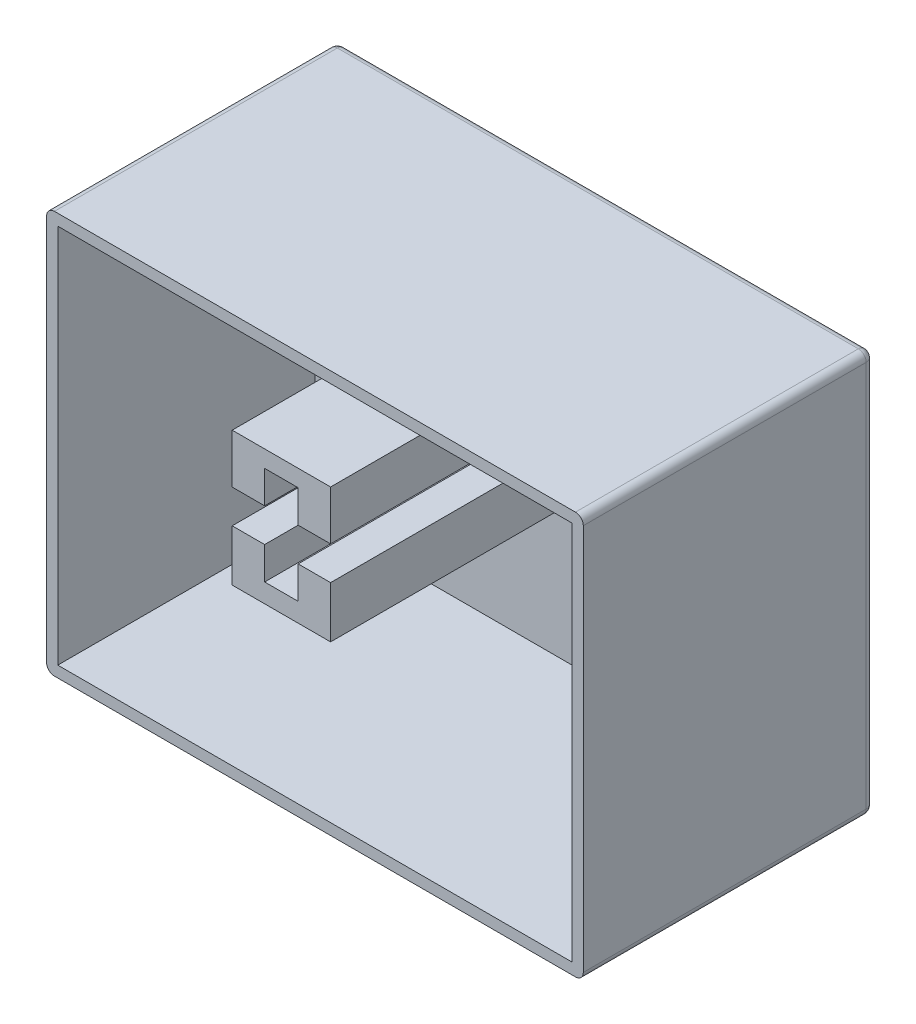
ISO-10303-21;
HEADER;
FILE_DESCRIPTION(('STEP AP214'),'2;1');
FILE_NAME('part.step','',(''),(''),'','','');
FILE_SCHEMA(('AUTOMOTIVE_DESIGN { 1 0 10303 214 1 1 1 1 }'));
ENDSEC;
DATA;
#1=APPLICATION_CONTEXT('core data for automotive mechanical design processes');
#2=APPLICATION_PROTOCOL_DEFINITION('international standard','automotive_design',2000,#1);
#3=PRODUCT_CONTEXT('',#1,'mechanical');
#4=PRODUCT('Part','Part','',(#3));
#5=PRODUCT_RELATED_PRODUCT_CATEGORY('part','',(#4));
#6=PRODUCT_DEFINITION_FORMATION('','',#4);
#7=PRODUCT_DEFINITION_CONTEXT('part definition',#1,'design');
#8=PRODUCT_DEFINITION('design','',#6,#7);
#9=PRODUCT_DEFINITION_SHAPE('','',#8);
#10=(LENGTH_UNIT() NAMED_UNIT(*) SI_UNIT(.MILLI.,.METRE.));
#11=(NAMED_UNIT(*) PLANE_ANGLE_UNIT() SI_UNIT($,.RADIAN.));
#12=(NAMED_UNIT(*) SI_UNIT($,.STERADIAN.) SOLID_ANGLE_UNIT());
#13=UNCERTAINTY_MEASURE_WITH_UNIT(LENGTH_MEASURE(1.E-05),#10,'distance_accuracy_value','');
#14=(GEOMETRIC_REPRESENTATION_CONTEXT(3) GLOBAL_UNCERTAINTY_ASSIGNED_CONTEXT((#13)) GLOBAL_UNIT_ASSIGNED_CONTEXT((#10,
#11,#12)) REPRESENTATION_CONTEXT('',''));
#15=CARTESIAN_POINT('',(0.,0.,0.));
#16=DIRECTION('',(0.,0.,1.));
#17=DIRECTION('',(1.,0.,0.));
#18=AXIS2_PLACEMENT_3D('',#15,#16,#17);
#19=CARTESIAN_POINT('',(-0.8,0.795549291488783,1.5));
#20=DIRECTION('',(0.,1.,0.));
#21=DIRECTION('',(-1.,0.,0.));
#22=AXIS2_PLACEMENT_3D('',#19,#20,#21);
#23=PLANE('',#22);
#24=DIRECTION('',(-1.,0.,0.));
#25=VECTOR('',#24,1.);
#26=CARTESIAN_POINT('',(-0.8,0.795549291488783,11.5));
#27=LINE('',#26,#25);
#28=CARTESIAN_POINT('',(-0.8,0.795549291488783,11.5));
#29=VERTEX_POINT('',#28);
#30=CARTESIAN_POINT('',(-2.25,0.795549291488783,11.5));
#31=VERTEX_POINT('',#30);
#32=EDGE_CURVE('E318',#29,#31,#27,.T.);
#33=ORIENTED_EDGE('',*,*,#32,.T.);
#34=DIRECTION('',(0.,0.,-1.));
#35=VECTOR('',#34,1.);
#36=CARTESIAN_POINT('',(-2.25,0.795549291488783,1.5));
#37=LINE('',#36,#35);
#38=CARTESIAN_POINT('',(-2.25,0.795549291488783,1.5));
#39=VERTEX_POINT('',#38);
#40=EDGE_CURVE('E300',#31,#39,#37,.T.);
#41=ORIENTED_EDGE('',*,*,#40,.T.);
#42=DIRECTION('',(-1.,0.,0.));
#43=VECTOR('',#42,1.);
#44=CARTESIAN_POINT('',(-0.8,0.795549291488783,1.5));
#45=LINE('',#44,#43);
#46=CARTESIAN_POINT('',(-0.8,0.795549291488783,1.5));
#47=VERTEX_POINT('',#46);
#48=EDGE_CURVE('E245',#47,#39,#45,.T.);
#49=ORIENTED_EDGE('',*,*,#48,.F.);
#50=DIRECTION('',(0.,0.,1.));
#51=VECTOR('',#50,1.);
#52=CARTESIAN_POINT('',(-0.8,0.795549291488783,1.5));
#53=LINE('',#52,#51);
#54=EDGE_CURVE('E327',#47,#29,#53,.T.);
#55=ORIENTED_EDGE('',*,*,#54,.T.);
#56=EDGE_LOOP('',(#33,#41,#49,#55));
#57=FACE_BOUND('',#56,.T.);
#58=ADVANCED_FACE('F41',(#57),#23,.F.);
#59=CARTESIAN_POINT('',(-0.799999999999999,-0.704450708511217,1.5));
#60=DIRECTION('',(0.,-1.,0.));
#61=DIRECTION('',(0.,0.,-1.));
#62=AXIS2_PLACEMENT_3D('',#59,#60,#61);
#63=PLANE('',#62);
#64=DIRECTION('',(1.,0.,0.));
#65=VECTOR('',#64,1.);
#66=CARTESIAN_POINT('',(-0.799999999999999,-0.704450708511217,1.5));
#67=LINE('',#66,#65);
#68=CARTESIAN_POINT('',(-2.25,-0.704450708511217,1.5));
#69=VERTEX_POINT('',#68);
#70=CARTESIAN_POINT('',(-0.799999999999999,-0.704450708511217,1.5));
#71=VERTEX_POINT('',#70);
#72=EDGE_CURVE('E309',#69,#71,#67,.T.);
#73=ORIENTED_EDGE('',*,*,#72,.F.);
#74=DIRECTION('',(0.,0.,1.));
#75=VECTOR('',#74,1.);
#76=CARTESIAN_POINT('',(-2.25,-0.704450708511217,1.5));
#77=LINE('',#76,#75);
#78=CARTESIAN_POINT('',(-2.25,-0.704450708511217,11.5));
#79=VERTEX_POINT('',#78);
#80=EDGE_CURVE('E11',#69,#79,#77,.T.);
#81=ORIENTED_EDGE('',*,*,#80,.T.);
#82=DIRECTION('',(1.,0.,0.));
#83=VECTOR('',#82,1.);
#84=CARTESIAN_POINT('',(-0.799999999999999,-0.704450708511217,11.5));
#85=LINE('',#84,#83);
#86=CARTESIAN_POINT('',(-0.799999999999999,-0.704450708511217,11.5));
#87=VERTEX_POINT('',#86);
#88=EDGE_CURVE('E303',#79,#87,#85,.T.);
#89=ORIENTED_EDGE('',*,*,#88,.T.);
#90=DIRECTION('',(0.,0.,1.));
#91=VECTOR('',#90,1.);
#92=CARTESIAN_POINT('',(-0.799999999999999,-0.704450708511217,1.5));
#93=LINE('',#92,#91);
#94=EDGE_CURVE('E330',#71,#87,#93,.T.);
#95=ORIENTED_EDGE('',*,*,#94,.F.);
#96=EDGE_LOOP('',(#73,#81,#89,#95));
#97=FACE_BOUND('',#96,.T.);
#98=ADVANCED_FACE('F578',(#97),#63,.F.);
#99=CARTESIAN_POINT('',(-0.799999999999999,-3.,11.5));
#100=DIRECTION('',(-1.,0.,0.));
#101=DIRECTION('',(0.,0.,1.));
#102=AXIS2_PLACEMENT_3D('',#99,#100,#101);
#103=PLANE('',#102);
#104=DIRECTION('',(0.,1.,0.));
#105=VECTOR('',#104,1.);
#106=CARTESIAN_POINT('',(-0.799999999999999,-3.,11.5));
#107=LINE('',#106,#105);
#108=CARTESIAN_POINT('',(-0.799999999999999,3.,11.5));
#109=VERTEX_POINT('',#108);
#110=EDGE_CURVE('E341',#29,#109,#107,.T.);
#111=ORIENTED_EDGE('',*,*,#110,.F.);
#112=ORIENTED_EDGE('',*,*,#54,.F.);
#113=DIRECTION('',(0.,1.,0.));
#114=VECTOR('',#113,1.);
#115=CARTESIAN_POINT('',(-0.799999999999999,-3.,1.5));
#116=LINE('',#115,#114);
#117=CARTESIAN_POINT('',(-0.799999999999999,3.,1.5));
#118=VERTEX_POINT('',#117);
#119=EDGE_CURVE('E326',#47,#118,#116,.T.);
#120=ORIENTED_EDGE('',*,*,#119,.T.);
#121=DIRECTION('',(0.,0.,-1.));
#122=VECTOR('',#121,1.);
#123=CARTESIAN_POINT('',(-0.799999999999999,3.,11.5));
#124=LINE('',#123,#122);
#125=EDGE_CURVE('E381',#109,#118,#124,.T.);
#126=ORIENTED_EDGE('',*,*,#125,.F.);
#127=EDGE_LOOP('',(#111,#112,#120,#126));
#128=FACE_BOUND('',#127,.T.);
#129=ADVANCED_FACE('F605',(#128),#103,.F.);
#130=CARTESIAN_POINT('',(-5.2,-3.,11.5));
#131=DIRECTION('',(1.,0.,0.));
#132=DIRECTION('',(0.,0.,-1.));
#133=AXIS2_PLACEMENT_3D('',#130,#131,#132);
#134=PLANE('',#133);
#135=DIRECTION('',(0.,-1.,0.));
#136=VECTOR('',#135,1.);
#137=CARTESIAN_POINT('',(-5.2,-3.,1.5));
#138=LINE('',#137,#136);
#139=CARTESIAN_POINT('',(-5.2,3.,1.5));
#140=VERTEX_POINT('',#139);
#141=CARTESIAN_POINT('',(-5.2,0.795549291488783,1.5));
#142=VERTEX_POINT('',#141);
#143=EDGE_CURVE('E362',#140,#142,#138,.T.);
#144=ORIENTED_EDGE('',*,*,#143,.T.);
#145=DIRECTION('',(0.,0.,1.));
#146=VECTOR('',#145,1.);
#147=CARTESIAN_POINT('',(-5.2,0.795549291488783,1.5));
#148=LINE('',#147,#146);
#149=CARTESIAN_POINT('',(-5.2,0.795549291488783,11.5));
#150=VERTEX_POINT('',#149);
#151=EDGE_CURVE('E322',#142,#150,#148,.T.);
#152=ORIENTED_EDGE('',*,*,#151,.T.);
#153=DIRECTION('',(0.,-1.,0.));
#154=VECTOR('',#153,1.);
#155=CARTESIAN_POINT('',(-5.2,-3.,11.5));
#156=LINE('',#155,#154);
#157=CARTESIAN_POINT('',(-5.2,3.,11.5));
#158=VERTEX_POINT('',#157);
#159=EDGE_CURVE('E345',#158,#150,#156,.T.);
#160=ORIENTED_EDGE('',*,*,#159,.F.);
#161=DIRECTION('',(0.,0.,-1.));
#162=VECTOR('',#161,1.);
#163=CARTESIAN_POINT('',(-5.2,3.,11.5));
#164=LINE('',#163,#162);
#165=EDGE_CURVE('E377',#158,#140,#164,.T.);
#166=ORIENTED_EDGE('',*,*,#165,.T.);
#167=EDGE_LOOP('',(#144,#152,#160,#166));
#168=FACE_BOUND('',#167,.T.);
#169=ADVANCED_FACE('F608',(#168),#134,.F.);
#170=CARTESIAN_POINT('',(0.,0.,11.5));
#171=DIRECTION('',(0.,0.,-1.));
#172=DIRECTION('',(-1.,0.,0.));
#173=AXIS2_PLACEMENT_3D('',#170,#171,#172);
#174=PLANE('',#173);
#175=DIRECTION('',(-1.,0.,0.));
#176=VECTOR('',#175,1.);
#177=CARTESIAN_POINT('',(-3.75,2.24554929148878,11.5));
#178=LINE('',#177,#176);
#179=CARTESIAN_POINT('',(-2.25,2.24554929148878,11.5));
#180=VERTEX_POINT('',#179);
#181=CARTESIAN_POINT('',(-3.75,2.24554929148878,11.5));
#182=VERTEX_POINT('',#181);
#183=EDGE_CURVE('E277',#180,#182,#178,.T.);
#184=ORIENTED_EDGE('',*,*,#183,.F.);
#185=DIRECTION('',(0.,1.,0.));
#186=VECTOR('',#185,1.);
#187=CARTESIAN_POINT('',(-2.25,-2.15445070851122,11.5));
#188=LINE('',#187,#186);
#189=EDGE_CURVE('E255',#31,#180,#188,.T.);
#190=ORIENTED_EDGE('',*,*,#189,.F.);
#191=ORIENTED_EDGE('',*,*,#32,.F.);
#192=ORIENTED_EDGE('',*,*,#110,.T.);
#193=DIRECTION('',(-1.,0.,0.));
#194=VECTOR('',#193,1.);
#195=CARTESIAN_POINT('',(-5.2,3.,11.5));
#196=LINE('',#195,#194);
#197=EDGE_CURVE('E340',#109,#158,#196,.T.);
#198=ORIENTED_EDGE('',*,*,#197,.T.);
#199=ORIENTED_EDGE('',*,*,#159,.T.);
#200=CARTESIAN_POINT('',(-3.75,0.795549291488783,11.5));
#201=VERTEX_POINT('',#200);
#202=EDGE_CURVE('E317',#201,#150,#27,.T.);
#203=ORIENTED_EDGE('',*,*,#202,.F.);
#204=DIRECTION('',(0.,-1.,0.));
#205=VECTOR('',#204,1.);
#206=CARTESIAN_POINT('',(-3.75,-2.15445070851122,11.5));
#207=LINE('',#206,#205);
#208=EDGE_CURVE('E281',#182,#201,#207,.T.);
#209=ORIENTED_EDGE('',*,*,#208,.F.);
#210=EDGE_LOOP('',(#184,#190,#191,#192,#198,#199,#203,#209));
#211=FACE_BOUND('',#210,.T.);
#212=ADVANCED_FACE('F597',(#211),#174,.F.);
#213=CARTESIAN_POINT('',(0.,0.,1.5));
#214=DIRECTION('',(0.,0.,-1.));
#215=DIRECTION('',(-1.,0.,0.));
#216=AXIS2_PLACEMENT_3D('',#213,#214,#215);
#217=PLANE('',#216);
#218=DIRECTION('',(0.,1.,0.));
#219=VECTOR('',#218,1.);
#220=CARTESIAN_POINT('',(-2.25,-2.15445070851122,1.5));
#221=LINE('',#220,#219);
#222=CARTESIAN_POINT('',(-2.25,-2.15445070851122,1.5));
#223=VERTEX_POINT('',#222);
#224=EDGE_CURVE('E65',#223,#69,#221,.T.);
#225=ORIENTED_EDGE('',*,*,#224,.T.);
#226=ORIENTED_EDGE('',*,*,#72,.T.);
#227=CARTESIAN_POINT('',(-0.799999999999999,-3.,1.5));
#228=VERTEX_POINT('',#227);
#229=EDGE_CURVE('E353',#228,#71,#116,.T.);
#230=ORIENTED_EDGE('',*,*,#229,.F.);
#231=DIRECTION('',(1.,0.,0.));
#232=VECTOR('',#231,1.);
#233=CARTESIAN_POINT('',(-5.2,-3.,1.5));
#234=LINE('',#233,#232);
#235=CARTESIAN_POINT('',(-5.2,-3.,1.5));
#236=VERTEX_POINT('',#235);
#237=EDGE_CURVE('E366',#236,#228,#234,.T.);
#238=ORIENTED_EDGE('',*,*,#237,.F.);
#239=CARTESIAN_POINT('',(-5.2,-0.704450708511217,1.5));
#240=VERTEX_POINT('',#239);
#241=EDGE_CURVE('E361',#240,#236,#138,.T.);
#242=ORIENTED_EDGE('',*,*,#241,.F.);
#243=CARTESIAN_POINT('',(-3.75,-0.704450708511217,1.5));
#244=VERTEX_POINT('',#243);
#245=EDGE_CURVE('E304',#240,#244,#67,.T.);
#246=ORIENTED_EDGE('',*,*,#245,.T.);
#247=DIRECTION('',(0.,-1.,0.));
#248=VECTOR('',#247,1.);
#249=CARTESIAN_POINT('',(-3.75,-2.15445070851122,1.5));
#250=LINE('',#249,#248);
#251=CARTESIAN_POINT('',(-3.75,-2.15445070851122,1.5));
#252=VERTEX_POINT('',#251);
#253=EDGE_CURVE('E265',#244,#252,#250,.T.);
#254=ORIENTED_EDGE('',*,*,#253,.T.);
#255=DIRECTION('',(1.,0.,0.));
#256=VECTOR('',#255,1.);
#257=CARTESIAN_POINT('',(-3.75,-2.15445070851122,1.5));
#258=LINE('',#257,#256);
#259=EDGE_CURVE('E261',#252,#223,#258,.T.);
#260=ORIENTED_EDGE('',*,*,#259,.T.);
#261=EDGE_LOOP('',(#225,#226,#230,#238,#242,#246,#254,#260));
#262=FACE_BOUND('',#261,.T.);
#263=DIRECTION('',(0.,1.,0.));
#264=VECTOR('',#263,1.);
#265=CARTESIAN_POINT('',(11.5,8.5,1.5));
#266=LINE('',#265,#264);
#267=CARTESIAN_POINT('',(11.5,-8.5,1.5));
#268=VERTEX_POINT('',#267);
#269=CARTESIAN_POINT('',(11.5,8.5,1.5));
#270=VERTEX_POINT('',#269);
#271=EDGE_CURVE('E386',#268,#270,#266,.T.);
#272=ORIENTED_EDGE('',*,*,#271,.T.);
#273=DIRECTION('',(-1.,0.,0.));
#274=VECTOR('',#273,1.);
#275=CARTESIAN_POINT('',(11.5,8.5,1.5));
#276=LINE('',#275,#274);
#277=CARTESIAN_POINT('',(-11.5,8.5,1.5));
#278=VERTEX_POINT('',#277);
#279=EDGE_CURVE('E390',#270,#278,#276,.T.);
#280=ORIENTED_EDGE('',*,*,#279,.T.);
#281=DIRECTION('',(0.,-1.,0.));
#282=VECTOR('',#281,1.);
#283=CARTESIAN_POINT('',(-11.5,8.5,1.5));
#284=LINE('',#283,#282);
#285=CARTESIAN_POINT('',(-11.5,-8.5,1.5));
#286=VERTEX_POINT('',#285);
#287=EDGE_CURVE('E395',#278,#286,#284,.T.);
#288=ORIENTED_EDGE('',*,*,#287,.T.);
#289=DIRECTION('',(1.,0.,0.));
#290=VECTOR('',#289,1.);
#291=CARTESIAN_POINT('',(11.5,-8.5,1.5));
#292=LINE('',#291,#290);
#293=EDGE_CURVE('E399',#286,#268,#292,.T.);
#294=ORIENTED_EDGE('',*,*,#293,.T.);
#295=EDGE_LOOP('',(#272,#280,#288,#294));
#296=FACE_BOUND('',#295,.T.);
#297=ORIENTED_EDGE('',*,*,#48,.T.);
#298=CARTESIAN_POINT('',(-2.25,2.24554929148878,1.5));
#299=VERTEX_POINT('',#298);
#300=EDGE_CURVE('E239',#39,#299,#221,.T.);
#301=ORIENTED_EDGE('',*,*,#300,.T.);
#302=DIRECTION('',(-1.,0.,0.));
#303=VECTOR('',#302,1.);
#304=CARTESIAN_POINT('',(-3.75,2.24554929148878,1.5));
#305=LINE('',#304,#303);
#306=CARTESIAN_POINT('',(-3.75,2.24554929148878,1.5));
#307=VERTEX_POINT('',#306);
#308=EDGE_CURVE('E243',#299,#307,#305,.T.);
#309=ORIENTED_EDGE('',*,*,#308,.T.);
#310=CARTESIAN_POINT('',(-3.75,0.795549291488783,1.5));
#311=VERTEX_POINT('',#310);
#312=EDGE_CURVE('E57',#307,#311,#250,.T.);
#313=ORIENTED_EDGE('',*,*,#312,.T.);
#314=EDGE_CURVE('E308',#311,#142,#45,.T.);
#315=ORIENTED_EDGE('',*,*,#314,.T.);
#316=ORIENTED_EDGE('',*,*,#143,.F.);
#317=DIRECTION('',(-1.,0.,0.));
#318=VECTOR('',#317,1.);
#319=CARTESIAN_POINT('',(-5.2,3.,1.5));
#320=LINE('',#319,#318);
#321=EDGE_CURVE('E357',#118,#140,#320,.T.);
#322=ORIENTED_EDGE('',*,*,#321,.F.);
#323=ORIENTED_EDGE('',*,*,#119,.F.);
#324=EDGE_LOOP('',(#297,#301,#309,#313,#315,#316,#322,#323));
#325=FACE_BOUND('',#324,.T.);
#326=ADVANCED_FACE('F241',(#262,#296,#325),#217,.F.);
#327=CARTESIAN_POINT('',(12.,-9.,13.));
#328=DIRECTION('',(-1.,0.,0.));
#329=DIRECTION('',(0.,0.,1.));
#330=AXIS2_PLACEMENT_3D('',#327,#328,#329);
#331=PLANE('',#330);
#332=DIRECTION('',(0.,1.,0.));
#333=VECTOR('',#332,1.);
#334=CARTESIAN_POINT('',(12.,9.,0.35));
#335=LINE('',#334,#333);
#336=CARTESIAN_POINT('',(12.,-8.65,0.35));
#337=VERTEX_POINT('',#336);
#338=CARTESIAN_POINT('',(12.,8.65,0.35));
#339=VERTEX_POINT('',#338);
#340=EDGE_CURVE('E471',#337,#339,#335,.T.);
#341=ORIENTED_EDGE('',*,*,#340,.T.);
#342=DIRECTION('',(0.,0.,-1.));
#343=VECTOR('',#342,1.);
#344=CARTESIAN_POINT('',(12.,8.65,13.));
#345=LINE('',#344,#343);
#346=CARTESIAN_POINT('',(12.,8.65,13.));
#347=VERTEX_POINT('',#346);
#348=EDGE_CURVE('E516',#339,#347,#345,.F.);
#349=ORIENTED_EDGE('',*,*,#348,.T.);
#350=DIRECTION('',(0.,1.,0.));
#351=VECTOR('',#350,1.);
#352=CARTESIAN_POINT('',(12.,-9.,13.));
#353=LINE('',#352,#351);
#354=CARTESIAN_POINT('',(12.,-8.65,13.));
#355=VERTEX_POINT('',#354);
#356=EDGE_CURVE('E430',#355,#347,#353,.T.);
#357=ORIENTED_EDGE('',*,*,#356,.F.);
#358=DIRECTION('',(0.,0.,-1.));
#359=VECTOR('',#358,1.);
#360=CARTESIAN_POINT('',(12.,-8.65,13.));
#361=LINE('',#360,#359);
#362=EDGE_CURVE('E513',#355,#337,#361,.T.);
#363=ORIENTED_EDGE('',*,*,#362,.T.);
#364=EDGE_LOOP('',(#341,#349,#357,#363));
#365=FACE_BOUND('',#364,.T.);
#366=ADVANCED_FACE('F642',(#365),#331,.F.);
#367=CARTESIAN_POINT('',(-12.,9.,13.));
#368=DIRECTION('',(0.,-1.,0.));
#369=DIRECTION('',(0.,0.,-1.));
#370=AXIS2_PLACEMENT_3D('',#367,#368,#369);
#371=PLANE('',#370);
#372=DIRECTION('',(-1.,0.,0.));
#373=VECTOR('',#372,1.);
#374=CARTESIAN_POINT('',(-12.,9.,13.));
#375=LINE('',#374,#373);
#376=CARTESIAN_POINT('',(11.65,9.,13.));
#377=VERTEX_POINT('',#376);
#378=CARTESIAN_POINT('',(-11.65,9.,13.));
#379=VERTEX_POINT('',#378);
#380=EDGE_CURVE('E434',#377,#379,#375,.T.);
#381=ORIENTED_EDGE('',*,*,#380,.F.);
#382=DIRECTION('',(0.,0.,-1.));
#383=VECTOR('',#382,1.);
#384=CARTESIAN_POINT('',(11.65,9.,13.));
#385=LINE('',#384,#383);
#386=CARTESIAN_POINT('',(11.65,9.,0.35));
#387=VERTEX_POINT('',#386);
#388=EDGE_CURVE('E510',#377,#387,#385,.T.);
#389=ORIENTED_EDGE('',*,*,#388,.T.);
#390=DIRECTION('',(-1.,0.,0.));
#391=VECTOR('',#390,1.);
#392=CARTESIAN_POINT('',(-12.,9.,0.35));
#393=LINE('',#392,#391);
#394=CARTESIAN_POINT('',(-11.65,9.,0.35));
#395=VERTEX_POINT('',#394);
#396=EDGE_CURVE('E475',#387,#395,#393,.T.);
#397=ORIENTED_EDGE('',*,*,#396,.T.);
#398=DIRECTION('',(0.,0.,-1.));
#399=VECTOR('',#398,1.);
#400=CARTESIAN_POINT('',(-11.65,9.,13.));
#401=LINE('',#400,#399);
#402=EDGE_CURVE('E507',#395,#379,#401,.F.);
#403=ORIENTED_EDGE('',*,*,#402,.T.);
#404=EDGE_LOOP('',(#381,#389,#397,#403));
#405=FACE_BOUND('',#404,.T.);
#406=ADVANCED_FACE('F691',(#405),#371,.F.);
#407=CARTESIAN_POINT('',(-12.,-9.,13.));
#408=DIRECTION('',(1.,0.,0.));
#409=DIRECTION('',(0.,0.,-1.));
#410=AXIS2_PLACEMENT_3D('',#407,#408,#409);
#411=PLANE('',#410);
#412=DIRECTION('',(0.,-1.,0.));
#413=VECTOR('',#412,1.);
#414=CARTESIAN_POINT('',(-12.,-9.,13.));
#415=LINE('',#414,#413);
#416=CARTESIAN_POINT('',(-12.,8.65,13.));
#417=VERTEX_POINT('',#416);
#418=CARTESIAN_POINT('',(-12.,-8.65,13.));
#419=VERTEX_POINT('',#418);
#420=EDGE_CURVE('E439',#417,#419,#415,.T.);
#421=ORIENTED_EDGE('',*,*,#420,.F.);
#422=DIRECTION('',(0.,0.,-1.));
#423=VECTOR('',#422,1.);
#424=CARTESIAN_POINT('',(-12.,8.65,13.));
#425=LINE('',#424,#423);
#426=CARTESIAN_POINT('',(-12.,8.65,0.35));
#427=VERTEX_POINT('',#426);
#428=EDGE_CURVE('E534',#417,#427,#425,.T.);
#429=ORIENTED_EDGE('',*,*,#428,.T.);
#430=DIRECTION('',(0.,-1.,0.));
#431=VECTOR('',#430,1.);
#432=CARTESIAN_POINT('',(-12.,-9.,0.35));
#433=LINE('',#432,#431);
#434=CARTESIAN_POINT('',(-12.,-8.65,0.35));
#435=VERTEX_POINT('',#434);
#436=EDGE_CURVE('E447',#427,#435,#433,.T.);
#437=ORIENTED_EDGE('',*,*,#436,.T.);
#438=DIRECTION('',(0.,0.,-1.));
#439=VECTOR('',#438,1.);
#440=CARTESIAN_POINT('',(-12.,-8.65,13.));
#441=LINE('',#440,#439);
#442=EDGE_CURVE('E531',#435,#419,#441,.F.);
#443=ORIENTED_EDGE('',*,*,#442,.T.);
#444=EDGE_LOOP('',(#421,#429,#437,#443));
#445=FACE_BOUND('',#444,.T.);
#446=ADVANCED_FACE('F687',(#445),#411,.F.);
#447=CARTESIAN_POINT('',(-12.,-9.,13.));
#448=DIRECTION('',(0.,1.,0.));
#449=DIRECTION('',(0.,0.,1.));
#450=AXIS2_PLACEMENT_3D('',#447,#448,#449);
#451=PLANE('',#450);
#452=DIRECTION('',(1.,0.,0.));
#453=VECTOR('',#452,1.);
#454=CARTESIAN_POINT('',(12.,-9.,0.35));
#455=LINE('',#454,#453);
#456=CARTESIAN_POINT('',(-11.65,-9.,0.35));
#457=VERTEX_POINT('',#456);
#458=CARTESIAN_POINT('',(11.65,-9.,0.35));
#459=VERTEX_POINT('',#458);
#460=EDGE_CURVE('E467',#457,#459,#455,.T.);
#461=ORIENTED_EDGE('',*,*,#460,.T.);
#462=DIRECTION('',(0.,0.,-1.));
#463=VECTOR('',#462,1.);
#464=CARTESIAN_POINT('',(11.65,-9.,13.));
#465=LINE('',#464,#463);
#466=CARTESIAN_POINT('',(11.65,-9.,13.));
#467=VERTEX_POINT('',#466);
#468=EDGE_CURVE('E540',#459,#467,#465,.F.);
#469=ORIENTED_EDGE('',*,*,#468,.T.);
#470=DIRECTION('',(1.,0.,0.));
#471=VECTOR('',#470,1.);
#472=CARTESIAN_POINT('',(-12.,-9.,13.));
#473=LINE('',#472,#471);
#474=CARTESIAN_POINT('',(-11.65,-9.,13.));
#475=VERTEX_POINT('',#474);
#476=EDGE_CURVE('E443',#475,#467,#473,.T.);
#477=ORIENTED_EDGE('',*,*,#476,.F.);
#478=DIRECTION('',(0.,0.,-1.));
#479=VECTOR('',#478,1.);
#480=CARTESIAN_POINT('',(-11.65,-9.,13.));
#481=LINE('',#480,#479);
#482=EDGE_CURVE('E537',#475,#457,#481,.T.);
#483=ORIENTED_EDGE('',*,*,#482,.T.);
#484=EDGE_LOOP('',(#461,#469,#477,#483));
#485=FACE_BOUND('',#484,.T.);
#486=ADVANCED_FACE('F679',(#485),#451,.F.);
#487=CARTESIAN_POINT('',(0.,0.,13.));
#488=DIRECTION('',(0.,0.,-1.));
#489=DIRECTION('',(-1.,0.,0.));
#490=AXIS2_PLACEMENT_3D('',#487,#488,#489);
#491=PLANE('',#490);
#492=DIRECTION('',(-1.,0.,0.));
#493=VECTOR('',#492,1.);
#494=CARTESIAN_POINT('',(11.5,8.5,13.));
#495=LINE('',#494,#493);
#496=CARTESIAN_POINT('',(11.5,8.5,13.));
#497=VERTEX_POINT('',#496);
#498=CARTESIAN_POINT('',(-11.5,8.5,13.));
#499=VERTEX_POINT('',#498);
#500=EDGE_CURVE('E406',#497,#499,#495,.T.);
#501=ORIENTED_EDGE('',*,*,#500,.F.);
#502=DIRECTION('',(0.,1.,0.));
#503=VECTOR('',#502,1.);
#504=CARTESIAN_POINT('',(11.5,8.5,13.));
#505=LINE('',#504,#503);
#506=CARTESIAN_POINT('',(11.5,-8.5,13.));
#507=VERTEX_POINT('',#506);
#508=EDGE_CURVE('E385',#507,#497,#505,.T.);
#509=ORIENTED_EDGE('',*,*,#508,.F.);
#510=DIRECTION('',(1.,0.,0.));
#511=VECTOR('',#510,1.);
#512=CARTESIAN_POINT('',(11.5,-8.5,13.));
#513=LINE('',#512,#511);
#514=CARTESIAN_POINT('',(-11.5,-8.5,13.));
#515=VERTEX_POINT('',#514);
#516=EDGE_CURVE('E391',#515,#507,#513,.T.);
#517=ORIENTED_EDGE('',*,*,#516,.F.);
#518=DIRECTION('',(0.,-1.,0.));
#519=VECTOR('',#518,1.);
#520=CARTESIAN_POINT('',(-11.5,8.5,13.));
#521=LINE('',#520,#519);
#522=EDGE_CURVE('E410',#499,#515,#521,.T.);
#523=ORIENTED_EDGE('',*,*,#522,.F.);
#524=EDGE_LOOP('',(#501,#509,#517,#523));
#525=FACE_BOUND('',#524,.T.);
#526=ORIENTED_EDGE('',*,*,#356,.T.);
#527=CARTESIAN_POINT('',(11.65,8.65,13.));
#528=DIRECTION('',(0.,0.,-1.));
#529=DIRECTION('',(-1.,0.,0.));
#530=AXIS2_PLACEMENT_3D('',#527,#528,#529);
#531=CIRCLE('',#530,0.35);
#532=EDGE_CURVE('E528',#347,#377,#531,.F.);
#533=ORIENTED_EDGE('',*,*,#532,.T.);
#534=ORIENTED_EDGE('',*,*,#380,.T.);
#535=CARTESIAN_POINT('',(-11.65,8.65,13.));
#536=DIRECTION('',(0.,0.,-1.));
#537=DIRECTION('',(-1.,0.,0.));
#538=AXIS2_PLACEMENT_3D('',#535,#536,#537);
#539=CIRCLE('',#538,0.35);
#540=EDGE_CURVE('E525',#379,#417,#539,.F.);
#541=ORIENTED_EDGE('',*,*,#540,.T.);
#542=ORIENTED_EDGE('',*,*,#420,.T.);
#543=CARTESIAN_POINT('',(-11.65,-8.65,13.));
#544=DIRECTION('',(0.,0.,-1.));
#545=DIRECTION('',(-1.,0.,0.));
#546=AXIS2_PLACEMENT_3D('',#543,#544,#545);
#547=CIRCLE('',#546,0.35);
#548=EDGE_CURVE('E519',#419,#475,#547,.F.);
#549=ORIENTED_EDGE('',*,*,#548,.T.);
#550=ORIENTED_EDGE('',*,*,#476,.T.);
#551=CARTESIAN_POINT('',(11.65,-8.65,13.));
#552=DIRECTION('',(0.,0.,-1.));
#553=DIRECTION('',(-1.,0.,0.));
#554=AXIS2_PLACEMENT_3D('',#551,#552,#553);
#555=CIRCLE('',#554,0.35);
#556=EDGE_CURVE('E522',#467,#355,#555,.F.);
#557=ORIENTED_EDGE('',*,*,#556,.T.);
#558=EDGE_LOOP('',(#526,#533,#534,#541,#542,#549,#550,#557));
#559=FACE_BOUND('',#558,.T.);
#560=ADVANCED_FACE('F675',(#525,#559),#491,.F.);
#561=CARTESIAN_POINT('',(0.,0.,0.));
#562=DIRECTION('',(0.,0.,-1.));
#563=DIRECTION('',(-1.,0.,0.));
#564=AXIS2_PLACEMENT_3D('',#561,#562,#563);
#565=PLANE('',#564);
#566=DIRECTION('',(1.,0.,0.));
#567=VECTOR('',#566,1.);
#568=CARTESIAN_POINT('',(-12.,-8.65,0.));
#569=LINE('',#568,#567);
#570=CARTESIAN_POINT('',(11.65,-8.65,0.));
#571=VERTEX_POINT('',#570);
#572=CARTESIAN_POINT('',(-11.65,-8.65,0.));
#573=VERTEX_POINT('',#572);
#574=EDGE_CURVE('E459',#571,#573,#569,.F.);
#575=ORIENTED_EDGE('',*,*,#574,.T.);
#576=DIRECTION('',(0.,-1.,0.));
#577=VECTOR('',#576,1.);
#578=CARTESIAN_POINT('',(-11.65,9.,0.));
#579=LINE('',#578,#577);
#580=CARTESIAN_POINT('',(-11.65,8.65,0.));
#581=VERTEX_POINT('',#580);
#582=EDGE_CURVE('E463',#573,#581,#579,.F.);
#583=ORIENTED_EDGE('',*,*,#582,.T.);
#584=DIRECTION('',(-1.,0.,0.));
#585=VECTOR('',#584,1.);
#586=CARTESIAN_POINT('',(12.,8.65,0.));
#587=LINE('',#586,#585);
#588=CARTESIAN_POINT('',(11.65,8.65,0.));
#589=VERTEX_POINT('',#588);
#590=EDGE_CURVE('E451',#581,#589,#587,.F.);
#591=ORIENTED_EDGE('',*,*,#590,.T.);
#592=DIRECTION('',(0.,1.,0.));
#593=VECTOR('',#592,1.);
#594=CARTESIAN_POINT('',(11.65,-9.,0.));
#595=LINE('',#594,#593);
#596=EDGE_CURVE('E455',#589,#571,#595,.F.);
#597=ORIENTED_EDGE('',*,*,#596,.T.);
#598=EDGE_LOOP('',(#575,#583,#591,#597));
#599=FACE_BOUND('',#598,.T.);
#600=ADVANCED_FACE('F678',(#599),#565,.T.);
#601=CARTESIAN_POINT('',(11.65,-9.,0.35));
#602=DIRECTION('',(0.,-1.,0.));
#603=DIRECTION('',(0.,0.,-1.));
#604=AXIS2_PLACEMENT_3D('',#601,#602,#603);
#605=CYLINDRICAL_SURFACE('',#604,0.35);
#606=ORIENTED_EDGE('',*,*,#596,.F.);
#607=CARTESIAN_POINT('',(11.65,8.65,0.35));
#608=DIRECTION('',(0.,-1.,0.));
#609=DIRECTION('',(0.,0.,-1.));
#610=AXIS2_PLACEMENT_3D('',#607,#608,#609);
#611=CIRCLE('',#610,0.35);
#612=EDGE_CURVE('E489',#589,#339,#611,.T.);
#613=ORIENTED_EDGE('',*,*,#612,.T.);
#614=ORIENTED_EDGE('',*,*,#340,.F.);
#615=CARTESIAN_POINT('',(11.65,-8.65,0.35));
#616=DIRECTION('',(0.,-1.,0.));
#617=DIRECTION('',(0.,0.,-1.));
#618=AXIS2_PLACEMENT_3D('',#615,#616,#617);
#619=CIRCLE('',#618,0.35);
#620=EDGE_CURVE('E486',#337,#571,#619,.F.);
#621=ORIENTED_EDGE('',*,*,#620,.T.);
#622=EDGE_LOOP('',(#606,#613,#614,#621));
#623=FACE_BOUND('',#622,.T.);
#624=ADVANCED_FACE('F683',(#623),#605,.T.);
#625=CARTESIAN_POINT('',(-12.,8.65,0.35));
#626=DIRECTION('',(1.,0.,0.));
#627=DIRECTION('',(0.,0.,-1.));
#628=AXIS2_PLACEMENT_3D('',#625,#626,#627);
#629=CYLINDRICAL_SURFACE('',#628,0.35);
#630=ORIENTED_EDGE('',*,*,#396,.F.);
#631=CARTESIAN_POINT('',(11.65,8.65,0.35));
#632=DIRECTION('',(1.,0.,0.));
#633=DIRECTION('',(0.,0.,-1.));
#634=AXIS2_PLACEMENT_3D('',#631,#632,#633);
#635=CIRCLE('',#634,0.35);
#636=EDGE_CURVE('E482',#387,#589,#635,.F.);
#637=ORIENTED_EDGE('',*,*,#636,.T.);
#638=ORIENTED_EDGE('',*,*,#590,.F.);
#639=CARTESIAN_POINT('',(-11.65,8.65,0.35));
#640=DIRECTION('',(1.,0.,0.));
#641=DIRECTION('',(0.,0.,-1.));
#642=AXIS2_PLACEMENT_3D('',#639,#640,#641);
#643=CIRCLE('',#642,0.35);
#644=EDGE_CURVE('E479',#581,#395,#643,.T.);
#645=ORIENTED_EDGE('',*,*,#644,.T.);
#646=EDGE_LOOP('',(#630,#637,#638,#645));
#647=FACE_BOUND('',#646,.T.);
#648=ADVANCED_FACE('F707',(#647),#629,.T.);
#649=CARTESIAN_POINT('',(-12.,-8.65,0.35));
#650=DIRECTION('',(-1.,0.,0.));
#651=DIRECTION('',(0.,0.,1.));
#652=AXIS2_PLACEMENT_3D('',#649,#650,#651);
#653=CYLINDRICAL_SURFACE('',#652,0.35);
#654=ORIENTED_EDGE('',*,*,#574,.F.);
#655=CARTESIAN_POINT('',(11.65,-8.65,0.35));
#656=DIRECTION('',(-1.,0.,0.));
#657=DIRECTION('',(0.,0.,1.));
#658=AXIS2_PLACEMENT_3D('',#655,#656,#657);
#659=CIRCLE('',#658,0.35);
#660=EDGE_CURVE('E503',#571,#459,#659,.T.);
#661=ORIENTED_EDGE('',*,*,#660,.T.);
#662=ORIENTED_EDGE('',*,*,#460,.F.);
#663=CARTESIAN_POINT('',(-11.65,-8.65,0.35));
#664=DIRECTION('',(-1.,0.,0.));
#665=DIRECTION('',(0.,0.,1.));
#666=AXIS2_PLACEMENT_3D('',#663,#664,#665);
#667=CIRCLE('',#666,0.35);
#668=EDGE_CURVE('E500',#457,#573,#667,.F.);
#669=ORIENTED_EDGE('',*,*,#668,.T.);
#670=EDGE_LOOP('',(#654,#661,#662,#669));
#671=FACE_BOUND('',#670,.T.);
#672=ADVANCED_FACE('F703',(#671),#653,.T.);
#673=CARTESIAN_POINT('',(-11.65,-9.,0.35));
#674=DIRECTION('',(0.,1.,0.));
#675=DIRECTION('',(0.,0.,1.));
#676=AXIS2_PLACEMENT_3D('',#673,#674,#675);
#677=CYLINDRICAL_SURFACE('',#676,0.35);
#678=ORIENTED_EDGE('',*,*,#436,.F.);
#679=CARTESIAN_POINT('',(-11.65,8.65,0.35));
#680=DIRECTION('',(0.,1.,0.));
#681=DIRECTION('',(0.,0.,1.));
#682=AXIS2_PLACEMENT_3D('',#679,#680,#681);
#683=CIRCLE('',#682,0.35);
#684=EDGE_CURVE('E496',#427,#581,#683,.F.);
#685=ORIENTED_EDGE('',*,*,#684,.T.);
#686=ORIENTED_EDGE('',*,*,#582,.F.);
#687=CARTESIAN_POINT('',(-11.65,-8.65,0.35));
#688=DIRECTION('',(0.,1.,0.));
#689=DIRECTION('',(0.,0.,1.));
#690=AXIS2_PLACEMENT_3D('',#687,#688,#689);
#691=CIRCLE('',#690,0.35);
#692=EDGE_CURVE('E492',#573,#435,#691,.T.);
#693=ORIENTED_EDGE('',*,*,#692,.T.);
#694=EDGE_LOOP('',(#678,#685,#686,#693));
#695=FACE_BOUND('',#694,.T.);
#696=ADVANCED_FACE('F699',(#695),#677,.T.);
#697=CARTESIAN_POINT('',(11.65,8.65,13.));
#698=DIRECTION('',(0.,0.,-1.));
#699=DIRECTION('',(-1.,0.,0.));
#700=AXIS2_PLACEMENT_3D('',#697,#698,#699);
#701=CYLINDRICAL_SURFACE('',#700,0.35);
#702=ORIENTED_EDGE('',*,*,#532,.F.);
#703=ORIENTED_EDGE('',*,*,#348,.F.);
#704=CARTESIAN_POINT('',(11.65,8.65,0.35));
#705=DIRECTION('',(0.,0.,-1.));
#706=DIRECTION('',(-1.,0.,0.));
#707=AXIS2_PLACEMENT_3D('',#704,#705,#706);
#708=CIRCLE('',#707,0.35);
#709=EDGE_CURVE('E435',#387,#339,#708,.T.);
#710=ORIENTED_EDGE('',*,*,#709,.F.);
#711=ORIENTED_EDGE('',*,*,#388,.F.);
#712=EDGE_LOOP('',(#702,#703,#710,#711));
#713=FACE_BOUND('',#712,.T.);
#714=ADVANCED_FACE('F702',(#713),#701,.T.);
#715=CARTESIAN_POINT('',(11.65,8.65,0.35));
#716=DIRECTION('',(0.,0.,1.));
#717=DIRECTION('',(1.,0.,0.));
#718=AXIS2_PLACEMENT_3D('',#715,#716,#717);
#719=SPHERICAL_SURFACE('',#718,0.35);
#720=ORIENTED_EDGE('',*,*,#709,.T.);
#721=ORIENTED_EDGE('',*,*,#612,.F.);
#722=ORIENTED_EDGE('',*,*,#636,.F.);
#723=EDGE_LOOP('',(#720,#721,#722));
#724=FACE_BOUND('',#723,.T.);
#725=ADVANCED_FACE('F715',(#724),#719,.T.);
#726=CARTESIAN_POINT('',(-11.65,8.65,13.));
#727=DIRECTION('',(0.,0.,-1.));
#728=DIRECTION('',(-1.,0.,0.));
#729=AXIS2_PLACEMENT_3D('',#726,#727,#728);
#730=CYLINDRICAL_SURFACE('',#729,0.35);
#731=ORIENTED_EDGE('',*,*,#540,.F.);
#732=ORIENTED_EDGE('',*,*,#402,.F.);
#733=CARTESIAN_POINT('',(-11.65,8.65,0.35));
#734=DIRECTION('',(0.,0.,-1.));
#735=DIRECTION('',(-1.,0.,0.));
#736=AXIS2_PLACEMENT_3D('',#733,#734,#735);
#737=CIRCLE('',#736,0.35);
#738=EDGE_CURVE('E546',#427,#395,#737,.T.);
#739=ORIENTED_EDGE('',*,*,#738,.F.);
#740=ORIENTED_EDGE('',*,*,#428,.F.);
#741=EDGE_LOOP('',(#731,#732,#739,#740));
#742=FACE_BOUND('',#741,.T.);
#743=ADVANCED_FACE('F718',(#742),#730,.T.);
#744=CARTESIAN_POINT('',(-11.65,8.65,0.35));
#745=DIRECTION('',(0.,0.,1.));
#746=DIRECTION('',(1.,0.,0.));
#747=AXIS2_PLACEMENT_3D('',#744,#745,#746);
#748=SPHERICAL_SURFACE('',#747,0.35);
#749=ORIENTED_EDGE('',*,*,#738,.T.);
#750=ORIENTED_EDGE('',*,*,#644,.F.);
#751=ORIENTED_EDGE('',*,*,#684,.F.);
#752=EDGE_LOOP('',(#749,#750,#751));
#753=FACE_BOUND('',#752,.T.);
#754=ADVANCED_FACE('F723',(#753),#748,.T.);
#755=CARTESIAN_POINT('',(11.65,-8.65,13.));
#756=DIRECTION('',(0.,0.,-1.));
#757=DIRECTION('',(-1.,0.,0.));
#758=AXIS2_PLACEMENT_3D('',#755,#756,#757);
#759=CYLINDRICAL_SURFACE('',#758,0.35);
#760=ORIENTED_EDGE('',*,*,#556,.F.);
#761=ORIENTED_EDGE('',*,*,#468,.F.);
#762=CARTESIAN_POINT('',(11.65,-8.65,0.35));
#763=DIRECTION('',(0.,0.,-1.));
#764=DIRECTION('',(-1.,0.,0.));
#765=AXIS2_PLACEMENT_3D('',#762,#763,#764);
#766=CIRCLE('',#765,0.35);
#767=EDGE_CURVE('E550',#337,#459,#766,.T.);
#768=ORIENTED_EDGE('',*,*,#767,.F.);
#769=ORIENTED_EDGE('',*,*,#362,.F.);
#770=EDGE_LOOP('',(#760,#761,#768,#769));
#771=FACE_BOUND('',#770,.T.);
#772=ADVANCED_FACE('F726',(#771),#759,.T.);
#773=CARTESIAN_POINT('',(11.65,-8.65,0.35));
#774=DIRECTION('',(0.,0.,1.));
#775=DIRECTION('',(1.,0.,0.));
#776=AXIS2_PLACEMENT_3D('',#773,#774,#775);
#777=SPHERICAL_SURFACE('',#776,0.35);
#778=ORIENTED_EDGE('',*,*,#660,.F.);
#779=ORIENTED_EDGE('',*,*,#620,.F.);
#780=ORIENTED_EDGE('',*,*,#767,.T.);
#781=EDGE_LOOP('',(#778,#779,#780));
#782=FACE_BOUND('',#781,.T.);
#783=ADVANCED_FACE('F731',(#782),#777,.T.);
#784=CARTESIAN_POINT('',(-11.65,-8.65,13.));
#785=DIRECTION('',(0.,0.,-1.));
#786=DIRECTION('',(-1.,0.,0.));
#787=AXIS2_PLACEMENT_3D('',#784,#785,#786);
#788=CYLINDRICAL_SURFACE('',#787,0.35);
#789=ORIENTED_EDGE('',*,*,#548,.F.);
#790=ORIENTED_EDGE('',*,*,#442,.F.);
#791=CARTESIAN_POINT('',(-11.65,-8.65,0.35));
#792=DIRECTION('',(0.,0.,-1.));
#793=DIRECTION('',(-1.,0.,0.));
#794=AXIS2_PLACEMENT_3D('',#791,#792,#793);
#795=CIRCLE('',#794,0.35);
#796=EDGE_CURVE('E420',#457,#435,#795,.T.);
#797=ORIENTED_EDGE('',*,*,#796,.F.);
#798=ORIENTED_EDGE('',*,*,#482,.F.);
#799=EDGE_LOOP('',(#789,#790,#797,#798));
#800=FACE_BOUND('',#799,.T.);
#801=ADVANCED_FACE('F43',(#800),#788,.T.);
#802=CARTESIAN_POINT('',(-11.65,-8.65,0.35));
#803=DIRECTION('',(0.,0.,1.));
#804=DIRECTION('',(1.,0.,0.));
#805=AXIS2_PLACEMENT_3D('',#802,#803,#804);
#806=SPHERICAL_SURFACE('',#805,0.35);
#807=ORIENTED_EDGE('',*,*,#692,.F.);
#808=ORIENTED_EDGE('',*,*,#668,.F.);
#809=ORIENTED_EDGE('',*,*,#796,.T.);
#810=EDGE_LOOP('',(#807,#808,#809));
#811=FACE_BOUND('',#810,.T.);
#812=ADVANCED_FACE('F673',(#811),#806,.T.);
#813=CARTESIAN_POINT('',(11.5,8.5,1.5));
#814=DIRECTION('',(1.,0.,0.));
#815=DIRECTION('',(0.,1.,0.));
#816=AXIS2_PLACEMENT_3D('',#813,#814,#815);
#817=PLANE('',#816);
#818=ORIENTED_EDGE('',*,*,#508,.T.);
#819=DIRECTION('',(0.,0.,1.));
#820=VECTOR('',#819,1.);
#821=CARTESIAN_POINT('',(11.5,8.5,1.5));
#822=LINE('',#821,#820);
#823=EDGE_CURVE('E403',#270,#497,#822,.T.);
#824=ORIENTED_EDGE('',*,*,#823,.F.);
#825=ORIENTED_EDGE('',*,*,#271,.F.);
#826=DIRECTION('',(0.,0.,1.));
#827=VECTOR('',#826,1.);
#828=CARTESIAN_POINT('',(11.5,-8.5,1.5));
#829=LINE('',#828,#827);
#830=EDGE_CURVE('E417',#268,#507,#829,.T.);
#831=ORIENTED_EDGE('',*,*,#830,.T.);
#832=EDGE_LOOP('',(#818,#824,#825,#831));
#833=FACE_BOUND('',#832,.T.);
#834=ADVANCED_FACE('F663',(#833),#817,.F.);
#835=CARTESIAN_POINT('',(11.5,-8.5,1.5));
#836=DIRECTION('',(0.,-1.,0.));
#837=DIRECTION('',(1.,0.,0.));
#838=AXIS2_PLACEMENT_3D('',#835,#836,#837);
#839=PLANE('',#838);
#840=ORIENTED_EDGE('',*,*,#516,.T.);
#841=ORIENTED_EDGE('',*,*,#830,.F.);
#842=ORIENTED_EDGE('',*,*,#293,.F.);
#843=DIRECTION('',(0.,0.,1.));
#844=VECTOR('',#843,1.);
#845=CARTESIAN_POINT('',(-11.5,-8.5,1.5));
#846=LINE('',#845,#844);
#847=EDGE_CURVE('E421',#286,#515,#846,.T.);
#848=ORIENTED_EDGE('',*,*,#847,.T.);
#849=EDGE_LOOP('',(#840,#841,#842,#848));
#850=FACE_BOUND('',#849,.T.);
#851=ADVANCED_FACE('F659',(#850),#839,.F.);
#852=CARTESIAN_POINT('',(-11.5,8.5,1.5));
#853=DIRECTION('',(-1.,0.,0.));
#854=DIRECTION('',(0.,0.,1.));
#855=AXIS2_PLACEMENT_3D('',#852,#853,#854);
#856=PLANE('',#855);
#857=ORIENTED_EDGE('',*,*,#522,.T.);
#858=ORIENTED_EDGE('',*,*,#847,.F.);
#859=ORIENTED_EDGE('',*,*,#287,.F.);
#860=DIRECTION('',(0.,0.,1.));
#861=VECTOR('',#860,1.);
#862=CARTESIAN_POINT('',(-11.5,8.5,1.5));
#863=LINE('',#862,#861);
#864=EDGE_CURVE('E424',#278,#499,#863,.T.);
#865=ORIENTED_EDGE('',*,*,#864,.T.);
#866=EDGE_LOOP('',(#857,#858,#859,#865));
#867=FACE_BOUND('',#866,.T.);
#868=ADVANCED_FACE('F662',(#867),#856,.F.);
#869=CARTESIAN_POINT('',(11.5,8.5,1.5));
#870=DIRECTION('',(0.,1.,0.));
#871=DIRECTION('',(-1.,0.,0.));
#872=AXIS2_PLACEMENT_3D('',#869,#870,#871);
#873=PLANE('',#872);
#874=ORIENTED_EDGE('',*,*,#500,.T.);
#875=ORIENTED_EDGE('',*,*,#864,.F.);
#876=ORIENTED_EDGE('',*,*,#279,.F.);
#877=ORIENTED_EDGE('',*,*,#823,.T.);
#878=EDGE_LOOP('',(#874,#875,#876,#877));
#879=FACE_BOUND('',#878,.T.);
#880=ADVANCED_FACE('F657',(#879),#873,.F.);
#881=ORIENTED_EDGE('',*,*,#229,.T.);
#882=ORIENTED_EDGE('',*,*,#94,.T.);
#883=CARTESIAN_POINT('',(-0.799999999999999,-3.,11.5));
#884=VERTEX_POINT('',#883);
#885=EDGE_CURVE('E336',#884,#87,#107,.T.);
#886=ORIENTED_EDGE('',*,*,#885,.F.);
#887=DIRECTION('',(0.,0.,-1.));
#888=VECTOR('',#887,1.);
#889=CARTESIAN_POINT('',(-0.799999999999999,-3.,11.5));
#890=LINE('',#889,#888);
#891=EDGE_CURVE('E352',#884,#228,#890,.T.);
#892=ORIENTED_EDGE('',*,*,#891,.T.);
#893=EDGE_LOOP('',(#881,#882,#886,#892));
#894=FACE_BOUND('',#893,.T.);
#895=ADVANCED_FACE('F583',(#894),#103,.F.);
#896=CARTESIAN_POINT('',(-5.2,3.,11.5));
#897=DIRECTION('',(0.,-1.,0.));
#898=DIRECTION('',(0.,0.,-1.));
#899=AXIS2_PLACEMENT_3D('',#896,#897,#898);
#900=PLANE('',#899);
#901=ORIENTED_EDGE('',*,*,#321,.T.);
#902=ORIENTED_EDGE('',*,*,#165,.F.);
#903=ORIENTED_EDGE('',*,*,#197,.F.);
#904=ORIENTED_EDGE('',*,*,#125,.T.);
#905=EDGE_LOOP('',(#901,#902,#903,#904));
#906=FACE_BOUND('',#905,.T.);
#907=ADVANCED_FACE('F603',(#906),#900,.F.);
#908=CARTESIAN_POINT('',(-5.2,-0.704450708511217,11.5));
#909=VERTEX_POINT('',#908);
#910=CARTESIAN_POINT('',(-5.2,-3.,11.5));
#911=VERTEX_POINT('',#910);
#912=EDGE_CURVE('E344',#909,#911,#156,.T.);
#913=ORIENTED_EDGE('',*,*,#912,.F.);
#914=DIRECTION('',(0.,0.,1.));
#915=VECTOR('',#914,1.);
#916=CARTESIAN_POINT('',(-5.2,-0.704450708511217,1.5));
#917=LINE('',#916,#915);
#918=EDGE_CURVE('E312',#240,#909,#917,.T.);
#919=ORIENTED_EDGE('',*,*,#918,.F.);
#920=ORIENTED_EDGE('',*,*,#241,.T.);
#921=DIRECTION('',(0.,0.,-1.));
#922=VECTOR('',#921,1.);
#923=CARTESIAN_POINT('',(-5.2,-3.,11.5));
#924=LINE('',#923,#922);
#925=EDGE_CURVE('E373',#911,#236,#924,.T.);
#926=ORIENTED_EDGE('',*,*,#925,.F.);
#927=EDGE_LOOP('',(#913,#919,#920,#926));
#928=FACE_BOUND('',#927,.T.);
#929=ADVANCED_FACE('F590',(#928),#134,.F.);
#930=CARTESIAN_POINT('',(-5.2,-3.,11.5));
#931=DIRECTION('',(0.,1.,0.));
#932=DIRECTION('',(0.,0.,1.));
#933=AXIS2_PLACEMENT_3D('',#930,#931,#932);
#934=PLANE('',#933);
#935=ORIENTED_EDGE('',*,*,#237,.T.);
#936=ORIENTED_EDGE('',*,*,#891,.F.);
#937=DIRECTION('',(1.,0.,0.));
#938=VECTOR('',#937,1.);
#939=CARTESIAN_POINT('',(-5.2,-3.,11.5));
#940=LINE('',#939,#938);
#941=EDGE_CURVE('E349',#911,#884,#940,.T.);
#942=ORIENTED_EDGE('',*,*,#941,.F.);
#943=ORIENTED_EDGE('',*,*,#925,.T.);
#944=EDGE_LOOP('',(#935,#936,#942,#943));
#945=FACE_BOUND('',#944,.T.);
#946=ADVANCED_FACE('F589',(#945),#934,.F.);
#947=ORIENTED_EDGE('',*,*,#88,.F.);
#948=CARTESIAN_POINT('',(-2.25,-2.15445070851122,11.5));
#949=VERTEX_POINT('',#948);
#950=EDGE_CURVE('E274',#949,#79,#188,.T.);
#951=ORIENTED_EDGE('',*,*,#950,.F.);
#952=DIRECTION('',(1.,0.,0.));
#953=VECTOR('',#952,1.);
#954=CARTESIAN_POINT('',(-3.75,-2.15445070851122,11.5));
#955=LINE('',#954,#953);
#956=CARTESIAN_POINT('',(-3.75,-2.15445070851122,11.5));
#957=VERTEX_POINT('',#956);
#958=EDGE_CURVE('E249',#957,#949,#955,.T.);
#959=ORIENTED_EDGE('',*,*,#958,.F.);
#960=CARTESIAN_POINT('',(-3.75,-0.704450708511217,11.5));
#961=VERTEX_POINT('',#960);
#962=EDGE_CURVE('E280',#961,#957,#207,.T.);
#963=ORIENTED_EDGE('',*,*,#962,.F.);
#964=EDGE_CURVE('E313',#909,#961,#85,.T.);
#965=ORIENTED_EDGE('',*,*,#964,.F.);
#966=ORIENTED_EDGE('',*,*,#912,.T.);
#967=ORIENTED_EDGE('',*,*,#941,.T.);
#968=ORIENTED_EDGE('',*,*,#885,.T.);
#969=EDGE_LOOP('',(#947,#951,#959,#963,#965,#966,#967,#968));
#970=FACE_BOUND('',#969,.T.);
#971=ADVANCED_FACE('F584',(#970),#174,.F.);
#972=ORIENTED_EDGE('',*,*,#314,.F.);
#973=DIRECTION('',(0.,0.,1.));
#974=VECTOR('',#973,1.);
#975=CARTESIAN_POINT('',(-3.75,0.795549291488783,1.5));
#976=LINE('',#975,#974);
#977=EDGE_CURVE('E290',#311,#201,#976,.T.);
#978=ORIENTED_EDGE('',*,*,#977,.T.);
#979=ORIENTED_EDGE('',*,*,#202,.T.);
#980=ORIENTED_EDGE('',*,*,#151,.F.);
#981=EDGE_LOOP('',(#972,#978,#979,#980));
#982=FACE_BOUND('',#981,.T.);
#983=ADVANCED_FACE('F614',(#982),#23,.F.);
#984=ORIENTED_EDGE('',*,*,#964,.T.);
#985=DIRECTION('',(0.,0.,-1.));
#986=VECTOR('',#985,1.);
#987=CARTESIAN_POINT('',(-3.75,-0.704450708511217,1.5));
#988=LINE('',#987,#986);
#989=EDGE_CURVE('E50',#961,#244,#988,.T.);
#990=ORIENTED_EDGE('',*,*,#989,.T.);
#991=ORIENTED_EDGE('',*,*,#245,.F.);
#992=ORIENTED_EDGE('',*,*,#918,.T.);
#993=EDGE_LOOP('',(#984,#990,#991,#992));
#994=FACE_BOUND('',#993,.T.);
#995=ADVANCED_FACE('F557',(#994),#63,.F.);
#996=CARTESIAN_POINT('',(-3.75,-2.15445070851122,1.5));
#997=DIRECTION('',(-1.,0.,0.));
#998=DIRECTION('',(0.,0.,1.));
#999=AXIS2_PLACEMENT_3D('',#996,#997,#998);
#1000=PLANE('',#999);
#1001=ORIENTED_EDGE('',*,*,#962,.T.);
#1002=DIRECTION('',(0.,0.,1.));
#1003=VECTOR('',#1002,1.);
#1004=CARTESIAN_POINT('',(-3.75,-2.15445070851122,1.5));
#1005=LINE('',#1004,#1003);
#1006=EDGE_CURVE('E291',#252,#957,#1005,.T.);
#1007=ORIENTED_EDGE('',*,*,#1006,.F.);
#1008=ORIENTED_EDGE('',*,*,#253,.F.);
#1009=ORIENTED_EDGE('',*,*,#989,.F.);
#1010=EDGE_LOOP('',(#1001,#1007,#1008,#1009));
#1011=FACE_BOUND('',#1010,.T.);
#1012=ADVANCED_FACE('F631',(#1011),#1000,.F.);
#1013=CARTESIAN_POINT('',(-2.25,-2.15445070851122,1.5));
#1014=DIRECTION('',(1.,0.,0.));
#1015=DIRECTION('',(0.,0.,-1.));
#1016=AXIS2_PLACEMENT_3D('',#1013,#1014,#1015);
#1017=PLANE('',#1016);
#1018=ORIENTED_EDGE('',*,*,#224,.F.);
#1019=DIRECTION('',(0.,0.,1.));
#1020=VECTOR('',#1019,1.);
#1021=CARTESIAN_POINT('',(-2.25,-2.15445070851122,1.5));
#1022=LINE('',#1021,#1020);
#1023=EDGE_CURVE('E287',#223,#949,#1022,.T.);
#1024=ORIENTED_EDGE('',*,*,#1023,.T.);
#1025=ORIENTED_EDGE('',*,*,#950,.T.);
#1026=ORIENTED_EDGE('',*,*,#80,.F.);
#1027=EDGE_LOOP('',(#1018,#1024,#1025,#1026));
#1028=FACE_BOUND('',#1027,.T.);
#1029=ADVANCED_FACE('F879',(#1028),#1017,.F.);
#1030=CARTESIAN_POINT('',(-3.75,-2.15445070851122,1.5));
#1031=DIRECTION('',(0.,-1.,0.));
#1032=DIRECTION('',(0.,0.,-1.));
#1033=AXIS2_PLACEMENT_3D('',#1030,#1031,#1032);
#1034=PLANE('',#1033);
#1035=ORIENTED_EDGE('',*,*,#958,.T.);
#1036=ORIENTED_EDGE('',*,*,#1023,.F.);
#1037=ORIENTED_EDGE('',*,*,#259,.F.);
#1038=ORIENTED_EDGE('',*,*,#1006,.T.);
#1039=EDGE_LOOP('',(#1035,#1036,#1037,#1038));
#1040=FACE_BOUND('',#1039,.T.);
#1041=ADVANCED_FACE('F888',(#1040),#1034,.F.);
#1042=ORIENTED_EDGE('',*,*,#189,.T.);
#1043=DIRECTION('',(0.,0.,1.));
#1044=VECTOR('',#1043,1.);
#1045=CARTESIAN_POINT('',(-2.25,2.24554929148878,1.5));
#1046=LINE('',#1045,#1044);
#1047=EDGE_CURVE('E252',#299,#180,#1046,.T.);
#1048=ORIENTED_EDGE('',*,*,#1047,.F.);
#1049=ORIENTED_EDGE('',*,*,#300,.F.);
#1050=ORIENTED_EDGE('',*,*,#40,.F.);
#1051=EDGE_LOOP('',(#1042,#1048,#1049,#1050));
#1052=FACE_BOUND('',#1051,.T.);
#1053=ADVANCED_FACE('F253',(#1052),#1017,.F.);
#1054=ORIENTED_EDGE('',*,*,#312,.F.);
#1055=DIRECTION('',(0.,0.,1.));
#1056=VECTOR('',#1055,1.);
#1057=CARTESIAN_POINT('',(-3.75,2.24554929148878,1.5));
#1058=LINE('',#1057,#1056);
#1059=EDGE_CURVE('E260',#307,#182,#1058,.T.);
#1060=ORIENTED_EDGE('',*,*,#1059,.T.);
#1061=ORIENTED_EDGE('',*,*,#208,.T.);
#1062=ORIENTED_EDGE('',*,*,#977,.F.);
#1063=EDGE_LOOP('',(#1054,#1060,#1061,#1062));
#1064=FACE_BOUND('',#1063,.T.);
#1065=ADVANCED_FACE('F616',(#1064),#1000,.F.);
#1066=CARTESIAN_POINT('',(-3.75,2.24554929148878,1.5));
#1067=DIRECTION('',(0.,1.,0.));
#1068=DIRECTION('',(0.,0.,1.));
#1069=AXIS2_PLACEMENT_3D('',#1066,#1067,#1068);
#1070=PLANE('',#1069);
#1071=ORIENTED_EDGE('',*,*,#183,.T.);
#1072=ORIENTED_EDGE('',*,*,#1059,.F.);
#1073=ORIENTED_EDGE('',*,*,#308,.F.);
#1074=ORIENTED_EDGE('',*,*,#1047,.T.);
#1075=EDGE_LOOP('',(#1071,#1072,#1073,#1074));
#1076=FACE_BOUND('',#1075,.T.);
#1077=ADVANCED_FACE('F263',(#1076),#1070,.F.);
#1078=CLOSED_SHELL('',(#58,#98,#129,#169,#212,#326,#366,#406,#446,#486,#560,#600,#624,#648,#672,
#696,#714,#725,#743,#754,#772,#783,#801,#812,#834,#851,#868,#880,#895,#907,#929,#946,#971,#983,
#995,#1012,#1029,#1041,#1053,#1065,#1077));
#1079=MANIFOLD_SOLID_BREP('B2',#1078);
#1080=ADVANCED_BREP_SHAPE_REPRESENTATION('',(#18,#1079),#14);
#1081=SHAPE_DEFINITION_REPRESENTATION(#9,#1080);
ENDSEC;
END-ISO-10303-21;
